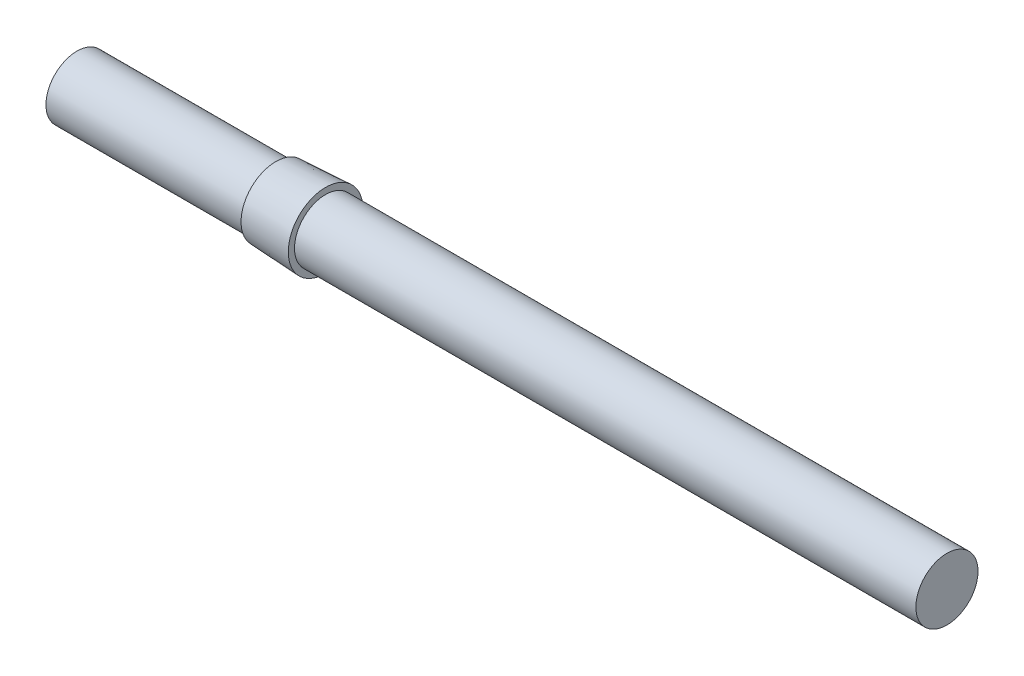
ISO-10303-21;
HEADER;
FILE_DESCRIPTION(('STEP AP214'),'2;1');
FILE_NAME('part.step','',(''),(''),'','','');
FILE_SCHEMA(('AUTOMOTIVE_DESIGN { 1 0 10303 214 1 1 1 1 }'));
ENDSEC;
DATA;
#1=APPLICATION_CONTEXT('core data for automotive mechanical design processes');
#2=APPLICATION_PROTOCOL_DEFINITION('international standard','automotive_design',2000,#1);
#3=PRODUCT_CONTEXT('',#1,'mechanical');
#4=PRODUCT('Part','Part','',(#3));
#5=PRODUCT_RELATED_PRODUCT_CATEGORY('part','',(#4));
#6=PRODUCT_DEFINITION_FORMATION('','',#4);
#7=PRODUCT_DEFINITION_CONTEXT('part definition',#1,'design');
#8=PRODUCT_DEFINITION('design','',#6,#7);
#9=PRODUCT_DEFINITION_SHAPE('','',#8);
#10=(LENGTH_UNIT() NAMED_UNIT(*) SI_UNIT(.MILLI.,.METRE.));
#11=(NAMED_UNIT(*) PLANE_ANGLE_UNIT() SI_UNIT($,.RADIAN.));
#12=(NAMED_UNIT(*) SI_UNIT($,.STERADIAN.) SOLID_ANGLE_UNIT());
#13=UNCERTAINTY_MEASURE_WITH_UNIT(LENGTH_MEASURE(1.E-05),#10,'distance_accuracy_value','');
#14=(GEOMETRIC_REPRESENTATION_CONTEXT(3) GLOBAL_UNCERTAINTY_ASSIGNED_CONTEXT((#13)) GLOBAL_UNIT_ASSIGNED_CONTEXT((#10,
#11,#12)) REPRESENTATION_CONTEXT('',''));
#15=CARTESIAN_POINT('',(0.,0.,0.));
#16=DIRECTION('',(0.,0.,1.));
#17=DIRECTION('',(1.,0.,0.));
#18=AXIS2_PLACEMENT_3D('',#15,#16,#17);
#19=CARTESIAN_POINT('',(350.,0.,0.));
#20=DIRECTION('',(-1.,0.,0.));
#21=DIRECTION('',(0.,0.,1.));
#22=AXIS2_PLACEMENT_3D('',#19,#20,#21);
#23=CYLINDRICAL_SURFACE('',#22,12.5);
#24=CARTESIAN_POINT('',(0.,0.,0.));
#25=DIRECTION('',(1.,0.,0.));
#26=DIRECTION('',(0.,0.,-1.));
#27=AXIS2_PLACEMENT_3D('',#24,#25,#26);
#28=CIRCLE('',#27,12.5);
#29=CARTESIAN_POINT('',(0.,0.,-12.5));
#30=VERTEX_POINT('',#29);
#31=EDGE_CURVE('E211',#30,#30,#28,.T.);
#32=ORIENTED_EDGE('',*,*,#31,.T.);
#33=EDGE_LOOP('',(#32));
#34=FACE_BOUND('',#33,.T.);
#35=CARTESIAN_POINT('',(80.,0.,0.));
#36=DIRECTION('',(1.,0.,0.));
#37=DIRECTION('',(0.,0.,-1.));
#38=AXIS2_PLACEMENT_3D('',#35,#36,#37);
#39=CIRCLE('',#38,12.5);
#40=CARTESIAN_POINT('',(80.,0.,-12.5));
#41=VERTEX_POINT('',#40);
#42=EDGE_CURVE('E12',#41,#41,#39,.T.);
#43=ORIENTED_EDGE('',*,*,#42,.F.);
#44=EDGE_LOOP('',(#43));
#45=FACE_BOUND('',#44,.T.);
#46=ADVANCED_FACE('F49',(#34,#45),#23,.T.);
#47=CARTESIAN_POINT('',(0.,0.,0.));
#48=DIRECTION('',(1.,0.,0.));
#49=DIRECTION('',(0.,0.,-1.));
#50=AXIS2_PLACEMENT_3D('',#47,#48,#49);
#51=PLANE('',#50);
#52=ORIENTED_EDGE('',*,*,#31,.F.);
#53=EDGE_LOOP('',(#52));
#54=FACE_BOUND('',#53,.T.);
#55=ADVANCED_FACE('F224',(#54),#51,.F.);
#56=CARTESIAN_POINT('',(80.,0.,0.));
#57=DIRECTION('',(1.,0.,0.));
#58=DIRECTION('',(0.,0.,-1.));
#59=AXIS2_PLACEMENT_3D('',#56,#57,#58);
#60=PLANE('',#59);
#61=ORIENTED_EDGE('',*,*,#42,.T.);
#62=EDGE_LOOP('',(#61));
#63=FACE_BOUND('',#62,.T.);
#64=CARTESIAN_POINT('',(80.,0.,0.));
#65=DIRECTION('',(1.,0.,0.));
#66=DIRECTION('',(0.,0.,-1.));
#67=AXIS2_PLACEMENT_3D('',#64,#65,#66);
#68=CIRCLE('',#67,14.);
#69=CARTESIAN_POINT('',(80.,0.,-14.));
#70=VERTEX_POINT('',#69);
#71=EDGE_CURVE('E189',#70,#70,#68,.T.);
#72=ORIENTED_EDGE('',*,*,#71,.F.);
#73=EDGE_LOOP('',(#72));
#74=FACE_BOUND('',#73,.T.);
#75=ADVANCED_FACE('F165',(#63,#74),#60,.F.);
#76=CARTESIAN_POINT('',(100.,0.,0.));
#77=DIRECTION('',(1.,0.,0.));
#78=DIRECTION('',(0.,0.,-1.));
#79=AXIS2_PLACEMENT_3D('',#76,#77,#78);
#80=PLANE('',#79);
#81=CARTESIAN_POINT('',(100.,0.,0.));
#82=DIRECTION('',(1.,0.,0.));
#83=DIRECTION('',(0.,0.,-1.));
#84=AXIS2_PLACEMENT_3D('',#81,#82,#83);
#85=CIRCLE('',#84,12.5);
#86=CARTESIAN_POINT('',(100.,0.,-12.5));
#87=VERTEX_POINT('',#86);
#88=EDGE_CURVE('E205',#87,#87,#85,.T.);
#89=ORIENTED_EDGE('',*,*,#88,.F.);
#90=EDGE_LOOP('',(#89));
#91=FACE_BOUND('',#90,.T.);
#92=CARTESIAN_POINT('',(100.,0.,0.));
#93=DIRECTION('',(1.,0.,0.));
#94=DIRECTION('',(0.,0.,-1.));
#95=AXIS2_PLACEMENT_3D('',#92,#93,#94);
#96=CIRCLE('',#95,15.);
#97=CARTESIAN_POINT('',(100.,0.,-15.));
#98=VERTEX_POINT('',#97);
#99=EDGE_CURVE('E136',#98,#98,#96,.T.);
#100=ORIENTED_EDGE('',*,*,#99,.T.);
#101=EDGE_LOOP('',(#100));
#102=FACE_BOUND('',#101,.T.);
#103=ADVANCED_FACE('F162',(#91,#102),#80,.T.);
#104=CARTESIAN_POINT('',(80.,0.,0.));
#105=DIRECTION('',(1.,0.,0.));
#106=DIRECTION('',(0.,0.,-1.));
#107=AXIS2_PLACEMENT_3D('',#104,#105,#106);
#108=CONICAL_SURFACE('',#107,14.,0.0499583957219427);
#109=ORIENTED_EDGE('',*,*,#99,.F.);
#110=EDGE_LOOP('',(#109));
#111=FACE_BOUND('',#110,.T.);
#112=ORIENTED_EDGE('',*,*,#71,.T.);
#113=EDGE_LOOP('',(#112));
#114=FACE_BOUND('',#113,.T.);
#115=ADVANCED_FACE('F151',(#111,#114),#108,.T.);
#116=CARTESIAN_POINT('',(350.,0.,0.));
#117=DIRECTION('',(1.,0.,0.));
#118=DIRECTION('',(0.,0.,-1.));
#119=AXIS2_PLACEMENT_3D('',#116,#117,#118);
#120=PLANE('',#119);
#121=CARTESIAN_POINT('',(350.,0.,0.));
#122=DIRECTION('',(1.,0.,0.));
#123=DIRECTION('',(0.,0.,-1.));
#124=AXIS2_PLACEMENT_3D('',#121,#122,#123);
#125=CIRCLE('',#124,12.5);
#126=CARTESIAN_POINT('',(350.,0.,-12.5));
#127=VERTEX_POINT('',#126);
#128=EDGE_CURVE('E59',#127,#127,#125,.T.);
#129=ORIENTED_EDGE('',*,*,#128,.T.);
#130=EDGE_LOOP('',(#129));
#131=FACE_BOUND('',#130,.T.);
#132=ADVANCED_FACE('F161',(#131),#120,.T.);
#133=ORIENTED_EDGE('',*,*,#88,.T.);
#134=EDGE_LOOP('',(#133));
#135=FACE_BOUND('',#134,.T.);
#136=ORIENTED_EDGE('',*,*,#128,.F.);
#137=EDGE_LOOP('',(#136));
#138=FACE_BOUND('',#137,.T.);
#139=ADVANCED_FACE('F51',(#135,#138),#23,.T.);
#140=CLOSED_SHELL('',(#46,#55,#75,#103,#115,#132,#139));
#141=CARTESIAN_POINT('',(0.,-3.99224616137765,3.));
#142=DIRECTION('',(0.,1.,0.));
#143=DIRECTION('',(0.,0.,1.));
#144=AXIS2_PLACEMENT_3D('',#141,#142,#143);
#145=PLANE('',#144);
#146=DIRECTION('',(-1.,0.,0.));
#147=VECTOR('',#146,1.);
#148=CARTESIAN_POINT('',(0.,-3.99224616137765,10.));
#149=LINE('',#148,#147);
#150=CARTESIAN_POINT('',(137.,-3.99224616137765,10.));
#151=VERTEX_POINT('',#150);
#152=CARTESIAN_POINT('',(100.,-3.99224616137765,10.));
#153=VERTEX_POINT('',#152);
#154=EDGE_CURVE('E124',#151,#153,#149,.T.);
#155=ORIENTED_EDGE('',*,*,#154,.F.);
#156=DIRECTION('',(0.,0.,1.));
#157=VECTOR('',#156,1.);
#158=CARTESIAN_POINT('',(137.,-3.99224616137765,3.));
#159=LINE('',#158,#157);
#160=CARTESIAN_POINT('',(137.,-3.99224616137765,3.));
#161=VERTEX_POINT('',#160);
#162=EDGE_CURVE('E113',#161,#151,#159,.T.);
#163=ORIENTED_EDGE('',*,*,#162,.F.);
#164=DIRECTION('',(-1.,0.,0.));
#165=VECTOR('',#164,1.);
#166=CARTESIAN_POINT('',(0.,-3.99224616137765,3.));
#167=LINE('',#166,#165);
#168=CARTESIAN_POINT('',(100.,-3.99224616137765,3.));
#169=VERTEX_POINT('',#168);
#170=EDGE_CURVE('E67',#161,#169,#167,.T.);
#171=ORIENTED_EDGE('',*,*,#170,.T.);
#172=DIRECTION('',(0.,0.,1.));
#173=VECTOR('',#172,1.);
#174=CARTESIAN_POINT('',(100.,-3.99224616137765,3.));
#175=LINE('',#174,#173);
#176=EDGE_CURVE('E88',#169,#153,#175,.T.);
#177=ORIENTED_EDGE('',*,*,#176,.T.);
#178=EDGE_LOOP('',(#155,#163,#171,#177));
#179=FACE_BOUND('',#178,.T.);
#180=ADVANCED_FACE('F273',(#179),#145,.T.);
#181=CARTESIAN_POINT('',(100.,0.,3.));
#182=DIRECTION('',(-1.,0.,0.));
#183=DIRECTION('',(0.,0.,1.));
#184=AXIS2_PLACEMENT_3D('',#181,#182,#183);
#185=PLANE('',#184);
#186=DIRECTION('',(0.,-1.,0.));
#187=VECTOR('',#186,1.);
#188=CARTESIAN_POINT('',(100.,0.,10.));
#189=LINE('',#188,#187);
#190=CARTESIAN_POINT('',(100.,4.00775383862235,10.));
#191=VERTEX_POINT('',#190);
#192=EDGE_CURVE('E119',#191,#153,#189,.T.);
#193=ORIENTED_EDGE('',*,*,#192,.T.);
#194=ORIENTED_EDGE('',*,*,#176,.F.);
#195=DIRECTION('',(0.,-1.,0.));
#196=VECTOR('',#195,1.);
#197=CARTESIAN_POINT('',(100.,0.,3.));
#198=LINE('',#197,#196);
#199=CARTESIAN_POINT('',(100.,4.00775383862235,3.));
#200=VERTEX_POINT('',#199);
#201=EDGE_CURVE('E108',#200,#169,#198,.T.);
#202=ORIENTED_EDGE('',*,*,#201,.F.);
#203=DIRECTION('',(0.,0.,1.));
#204=VECTOR('',#203,1.);
#205=CARTESIAN_POINT('',(100.,4.00775383862235,3.));
#206=LINE('',#205,#204);
#207=EDGE_CURVE('E84',#200,#191,#206,.T.);
#208=ORIENTED_EDGE('',*,*,#207,.T.);
#209=EDGE_LOOP('',(#193,#194,#202,#208));
#210=FACE_BOUND('',#209,.T.);
#211=ADVANCED_FACE('F277',(#210),#185,.F.);
#212=CARTESIAN_POINT('',(0.,4.00775383862234,3.));
#213=DIRECTION('',(0.,-1.,0.));
#214=DIRECTION('',(1.,0.,0.));
#215=AXIS2_PLACEMENT_3D('',#212,#213,#214);
#216=PLANE('',#215);
#217=DIRECTION('',(1.,0.,0.));
#218=VECTOR('',#217,1.);
#219=CARTESIAN_POINT('',(0.,4.00775383862234,10.));
#220=LINE('',#219,#218);
#221=CARTESIAN_POINT('',(137.,4.00775383862236,10.));
#222=VERTEX_POINT('',#221);
#223=EDGE_CURVE('E129',#191,#222,#220,.T.);
#224=ORIENTED_EDGE('',*,*,#223,.F.);
#225=ORIENTED_EDGE('',*,*,#207,.F.);
#226=DIRECTION('',(1.,0.,0.));
#227=VECTOR('',#226,1.);
#228=CARTESIAN_POINT('',(0.,4.00775383862234,3.));
#229=LINE('',#228,#227);
#230=CARTESIAN_POINT('',(137.,4.00775383862236,3.));
#231=VERTEX_POINT('',#230);
#232=EDGE_CURVE('E101',#200,#231,#229,.T.);
#233=ORIENTED_EDGE('',*,*,#232,.T.);
#234=DIRECTION('',(0.,0.,1.));
#235=VECTOR('',#234,1.);
#236=CARTESIAN_POINT('',(137.,4.00775383862236,3.));
#237=LINE('',#236,#235);
#238=EDGE_CURVE('E103',#231,#222,#237,.T.);
#239=ORIENTED_EDGE('',*,*,#238,.T.);
#240=EDGE_LOOP('',(#224,#225,#233,#239));
#241=FACE_BOUND('',#240,.T.);
#242=ADVANCED_FACE('F102',(#241),#216,.T.);
#243=CARTESIAN_POINT('',(137.,0.,3.));
#244=DIRECTION('',(-1.,0.,0.));
#245=DIRECTION('',(0.,0.,1.));
#246=AXIS2_PLACEMENT_3D('',#243,#244,#245);
#247=PLANE('',#246);
#248=DIRECTION('',(0.,-1.,0.));
#249=VECTOR('',#248,1.);
#250=CARTESIAN_POINT('',(137.,0.,10.));
#251=LINE('',#250,#249);
#252=EDGE_CURVE('E111',#222,#151,#251,.T.);
#253=ORIENTED_EDGE('',*,*,#252,.F.);
#254=ORIENTED_EDGE('',*,*,#238,.F.);
#255=DIRECTION('',(0.,-1.,0.));
#256=VECTOR('',#255,1.);
#257=CARTESIAN_POINT('',(137.,0.,3.));
#258=LINE('',#257,#256);
#259=EDGE_CURVE('E96',#231,#161,#258,.T.);
#260=ORIENTED_EDGE('',*,*,#259,.T.);
#261=ORIENTED_EDGE('',*,*,#162,.T.);
#262=EDGE_LOOP('',(#253,#254,#260,#261));
#263=FACE_BOUND('',#262,.T.);
#264=ADVANCED_FACE('F110',(#263),#247,.T.);
#265=CARTESIAN_POINT('',(0.,0.,3.));
#266=DIRECTION('',(0.,0.,1.));
#267=DIRECTION('',(1.,0.,0.));
#268=AXIS2_PLACEMENT_3D('',#265,#266,#267);
#269=PLANE('',#268);
#270=ORIENTED_EDGE('',*,*,#170,.F.);
#271=ORIENTED_EDGE('',*,*,#259,.F.);
#272=ORIENTED_EDGE('',*,*,#232,.F.);
#273=ORIENTED_EDGE('',*,*,#201,.T.);
#274=EDGE_LOOP('',(#270,#271,#272,#273));
#275=FACE_BOUND('',#274,.T.);
#276=ADVANCED_FACE('F115',(#275),#269,.T.);
#277=CARTESIAN_POINT('',(0.,0.,10.));
#278=DIRECTION('',(0.,0.,1.));
#279=DIRECTION('',(1.,0.,0.));
#280=AXIS2_PLACEMENT_3D('',#277,#278,#279);
#281=PLANE('',#280);
#282=ORIENTED_EDGE('',*,*,#154,.T.);
#283=ORIENTED_EDGE('',*,*,#192,.F.);
#284=ORIENTED_EDGE('',*,*,#223,.T.);
#285=ORIENTED_EDGE('',*,*,#252,.T.);
#286=EDGE_LOOP('',(#282,#283,#284,#285));
#287=FACE_BOUND('',#286,.T.);
#288=ADVANCED_FACE('F310',(#287),#281,.F.);
#289=CLOSED_SHELL('',(#180,#211,#242,#264,#276,#288));
#290=ORIENTED_CLOSED_SHELL('',*,#140,.T.);
#291=BREP_WITH_VOIDS('B2',#289,(#290));
#292=ADVANCED_BREP_SHAPE_REPRESENTATION('',(#18,#291),#14);
#293=SHAPE_DEFINITION_REPRESENTATION(#9,#292);
ENDSEC;
END-ISO-10303-21;
